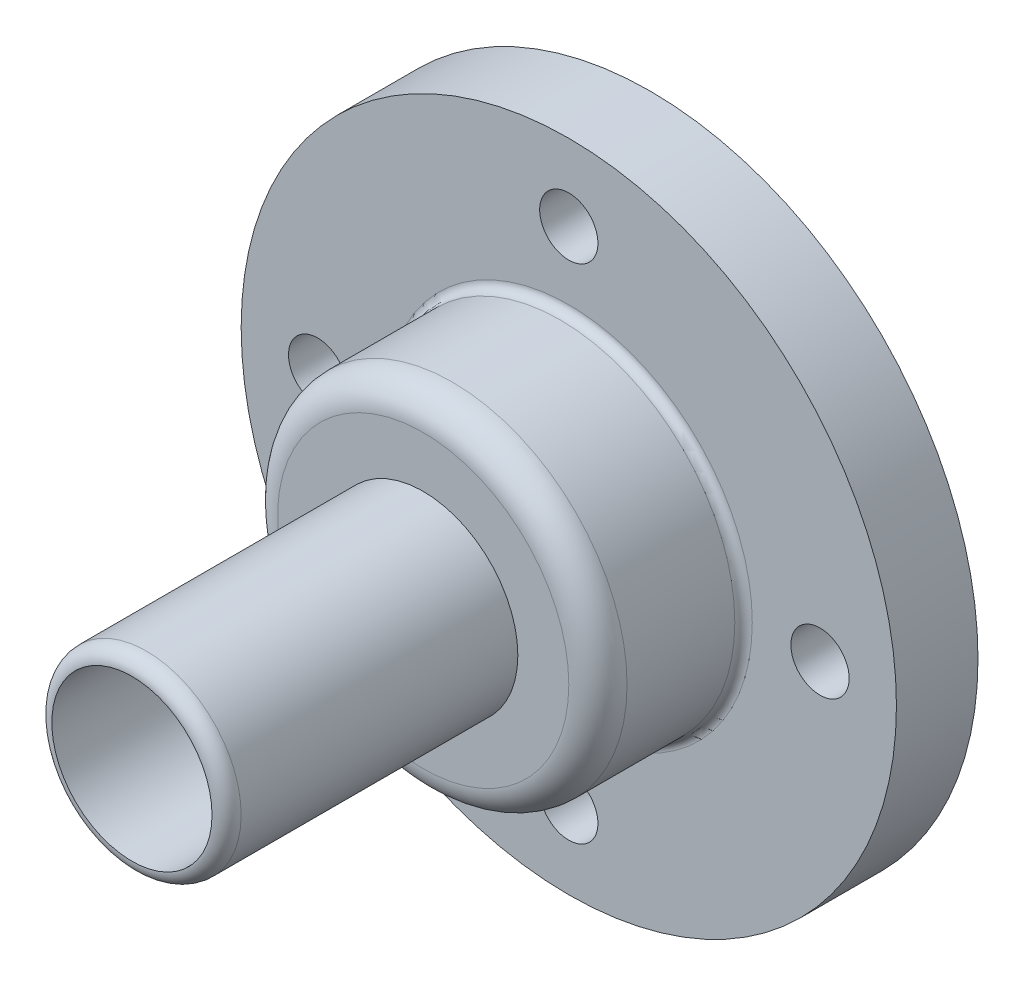
ISO-10303-21;
HEADER;
FILE_DESCRIPTION(('STEP AP214'),'2;1');
FILE_NAME('part.step','',(''),(''),'','','');
FILE_SCHEMA(('AUTOMOTIVE_DESIGN { 1 0 10303 214 1 1 1 1 }'));
ENDSEC;
DATA;
#1=APPLICATION_CONTEXT('core data for automotive mechanical design processes');
#2=APPLICATION_PROTOCOL_DEFINITION('international standard','automotive_design',2000,#1);
#3=PRODUCT_CONTEXT('',#1,'mechanical');
#4=PRODUCT('Part','Part','',(#3));
#5=PRODUCT_RELATED_PRODUCT_CATEGORY('part','',(#4));
#6=PRODUCT_DEFINITION_FORMATION('','',#4);
#7=PRODUCT_DEFINITION_CONTEXT('part definition',#1,'design');
#8=PRODUCT_DEFINITION('design','',#6,#7);
#9=PRODUCT_DEFINITION_SHAPE('','',#8);
#10=(LENGTH_UNIT() NAMED_UNIT(*) SI_UNIT(.MILLI.,.METRE.));
#11=(NAMED_UNIT(*) PLANE_ANGLE_UNIT() SI_UNIT($,.RADIAN.));
#12=(NAMED_UNIT(*) SI_UNIT($,.STERADIAN.) SOLID_ANGLE_UNIT());
#13=UNCERTAINTY_MEASURE_WITH_UNIT(LENGTH_MEASURE(1.E-05),#10,'distance_accuracy_value','');
#14=(GEOMETRIC_REPRESENTATION_CONTEXT(3) GLOBAL_UNCERTAINTY_ASSIGNED_CONTEXT((#13)) GLOBAL_UNIT_ASSIGNED_CONTEXT((#10,
#11,#12)) REPRESENTATION_CONTEXT('',''));
#15=CARTESIAN_POINT('',(0.,0.,0.));
#16=DIRECTION('',(0.,0.,1.));
#17=DIRECTION('',(1.,0.,0.));
#18=AXIS2_PLACEMENT_3D('',#15,#16,#17);
#19=CARTESIAN_POINT('',(0.,0.,28.));
#20=DIRECTION('',(0.,0.,-1.));
#21=DIRECTION('',(-1.,0.,0.));
#22=AXIS2_PLACEMENT_3D('',#19,#20,#21);
#23=CYLINDRICAL_SURFACE('',#22,112.5);
#24=CARTESIAN_POINT('',(0.,0.,28.));
#25=DIRECTION('',(0.,0.,1.));
#26=DIRECTION('',(1.,0.,0.));
#27=AXIS2_PLACEMENT_3D('',#24,#25,#26);
#28=CIRCLE('',#27,112.5);
#29=CARTESIAN_POINT('',(112.5,0.,28.));
#30=VERTEX_POINT('',#29);
#31=EDGE_CURVE('E57',#30,#30,#28,.T.);
#32=ORIENTED_EDGE('',*,*,#31,.F.);
#33=EDGE_LOOP('',(#32));
#34=FACE_BOUND('',#33,.T.);
#35=CARTESIAN_POINT('',(0.,0.,0.));
#36=DIRECTION('',(0.,0.,1.));
#37=DIRECTION('',(1.,0.,0.));
#38=AXIS2_PLACEMENT_3D('',#35,#36,#37);
#39=CIRCLE('',#38,112.5);
#40=CARTESIAN_POINT('',(112.5,0.,0.));
#41=VERTEX_POINT('',#40);
#42=EDGE_CURVE('E58',#41,#41,#39,.T.);
#43=ORIENTED_EDGE('',*,*,#42,.T.);
#44=EDGE_LOOP('',(#43));
#45=FACE_BOUND('',#44,.T.);
#46=ADVANCED_FACE('F34',(#34,#45),#23,.T.);
#47=CARTESIAN_POINT('',(0.,0.,28.));
#48=DIRECTION('',(0.,0.,1.));
#49=DIRECTION('',(1.,0.,0.));
#50=AXIS2_PLACEMENT_3D('',#47,#48,#49);
#51=PLANE('',#50);
#52=CARTESIAN_POINT('',(0.,86.25,28.));
#53=DIRECTION('',(0.,0.,1.));
#54=DIRECTION('',(1.,0.,0.));
#55=AXIS2_PLACEMENT_3D('',#52,#53,#54);
#56=CIRCLE('',#55,10.);
#57=CARTESIAN_POINT('',(10.,86.25,28.));
#58=VERTEX_POINT('',#57);
#59=EDGE_CURVE('E91',#58,#58,#56,.T.);
#60=ORIENTED_EDGE('',*,*,#59,.F.);
#61=EDGE_LOOP('',(#60));
#62=FACE_BOUND('',#61,.T.);
#63=CARTESIAN_POINT('',(86.2500000000024,2.43552857040838E-12,28.));
#64=DIRECTION('',(0.,0.,1.));
#65=DIRECTION('',(1.,0.,0.));
#66=AXIS2_PLACEMENT_3D('',#63,#64,#65);
#67=CIRCLE('',#66,10.0000000000019);
#68=CARTESIAN_POINT('',(96.2500000000043,2.43552857040838E-12,28.));
#69=VERTEX_POINT('',#68);
#70=EDGE_CURVE('E85',#69,#69,#67,.T.);
#71=ORIENTED_EDGE('',*,*,#70,.F.);
#72=EDGE_LOOP('',(#71));
#73=FACE_BOUND('',#72,.T.);
#74=CARTESIAN_POINT('',(4.87105714081675E-12,-86.25,28.));
#75=DIRECTION('',(0.,0.,1.));
#76=DIRECTION('',(1.,0.,0.));
#77=AXIS2_PLACEMENT_3D('',#74,#75,#76);
#78=CIRCLE('',#77,10.0000000000052);
#79=CARTESIAN_POINT('',(10.0000000000101,-86.25,28.));
#80=VERTEX_POINT('',#79);
#81=EDGE_CURVE('E79',#80,#80,#78,.T.);
#82=ORIENTED_EDGE('',*,*,#81,.F.);
#83=EDGE_LOOP('',(#82));
#84=FACE_BOUND('',#83,.T.);
#85=CARTESIAN_POINT('',(-86.2499999999976,-2.44609114905102E-12,28.));
#86=DIRECTION('',(0.,0.,1.));
#87=DIRECTION('',(1.,0.,0.));
#88=AXIS2_PLACEMENT_3D('',#85,#86,#87);
#89=CIRCLE('',#88,10.0000000000039);
#90=CARTESIAN_POINT('',(-76.2499999999937,-2.44609114905102E-12,28.));
#91=VERTEX_POINT('',#90);
#92=EDGE_CURVE('E73',#91,#91,#89,.T.);
#93=ORIENTED_EDGE('',*,*,#92,.F.);
#94=EDGE_LOOP('',(#93));
#95=FACE_BOUND('',#94,.T.);
#96=CARTESIAN_POINT('',(0.,0.,28.));
#97=DIRECTION('',(0.,0.,1.));
#98=DIRECTION('',(1.,0.,0.));
#99=AXIS2_PLACEMENT_3D('',#96,#97,#98);
#100=CIRCLE('',#99,63.);
#101=CARTESIAN_POINT('',(63.,0.,28.));
#102=VERTEX_POINT('',#101);
#103=EDGE_CURVE('E49',#102,#102,#100,.F.);
#104=ORIENTED_EDGE('',*,*,#103,.T.);
#105=EDGE_LOOP('',(#104));
#106=FACE_BOUND('',#105,.T.);
#107=ORIENTED_EDGE('',*,*,#31,.T.);
#108=EDGE_LOOP('',(#107));
#109=FACE_BOUND('',#108,.T.);
#110=ADVANCED_FACE('F107',(#62,#73,#84,#95,#106,#109),#51,.T.);
#111=CARTESIAN_POINT('',(0.,0.,0.));
#112=DIRECTION('',(0.,0.,1.));
#113=DIRECTION('',(1.,0.,0.));
#114=AXIS2_PLACEMENT_3D('',#111,#112,#113);
#115=PLANE('',#114);
#116=CARTESIAN_POINT('',(0.,86.25,0.));
#117=DIRECTION('',(0.,0.,1.));
#118=DIRECTION('',(1.,0.,0.));
#119=AXIS2_PLACEMENT_3D('',#116,#117,#118);
#120=CIRCLE('',#119,10.);
#121=CARTESIAN_POINT('',(10.,86.25,0.));
#122=VERTEX_POINT('',#121);
#123=EDGE_CURVE('E70',#122,#122,#120,.T.);
#124=ORIENTED_EDGE('',*,*,#123,.T.);
#125=EDGE_LOOP('',(#124));
#126=FACE_BOUND('',#125,.T.);
#127=CARTESIAN_POINT('',(86.2500000000024,2.43552857040838E-12,0.));
#128=DIRECTION('',(0.,0.,1.));
#129=DIRECTION('',(1.,0.,0.));
#130=AXIS2_PLACEMENT_3D('',#127,#128,#129);
#131=CIRCLE('',#130,10.0000000000019);
#132=CARTESIAN_POINT('',(96.2500000000043,2.43552857040838E-12,0.));
#133=VERTEX_POINT('',#132);
#134=EDGE_CURVE('E88',#133,#133,#131,.T.);
#135=ORIENTED_EDGE('',*,*,#134,.T.);
#136=EDGE_LOOP('',(#135));
#137=FACE_BOUND('',#136,.T.);
#138=CARTESIAN_POINT('',(4.87105714081675E-12,-86.25,0.));
#139=DIRECTION('',(0.,0.,1.));
#140=DIRECTION('',(1.,0.,0.));
#141=AXIS2_PLACEMENT_3D('',#138,#139,#140);
#142=CIRCLE('',#141,10.0000000000052);
#143=CARTESIAN_POINT('',(10.0000000000101,-86.25,0.));
#144=VERTEX_POINT('',#143);
#145=EDGE_CURVE('E82',#144,#144,#142,.T.);
#146=ORIENTED_EDGE('',*,*,#145,.T.);
#147=EDGE_LOOP('',(#146));
#148=FACE_BOUND('',#147,.T.);
#149=CARTESIAN_POINT('',(-86.2499999999976,-2.44609114905102E-12,0.));
#150=DIRECTION('',(0.,0.,1.));
#151=DIRECTION('',(1.,0.,0.));
#152=AXIS2_PLACEMENT_3D('',#149,#150,#151);
#153=CIRCLE('',#152,10.0000000000039);
#154=CARTESIAN_POINT('',(-76.2499999999937,-2.44609114905102E-12,0.));
#155=VERTEX_POINT('',#154);
#156=EDGE_CURVE('E76',#155,#155,#153,.T.);
#157=ORIENTED_EDGE('',*,*,#156,.T.);
#158=EDGE_LOOP('',(#157));
#159=FACE_BOUND('',#158,.T.);
#160=CARTESIAN_POINT('',(0.,0.,0.));
#161=DIRECTION('',(0.,0.,1.));
#162=DIRECTION('',(1.,0.,0.));
#163=AXIS2_PLACEMENT_3D('',#160,#161,#162);
#164=CIRCLE('',#163,27.5);
#165=CARTESIAN_POINT('',(27.5,0.,0.));
#166=VERTEX_POINT('',#165);
#167=EDGE_CURVE('E66',#166,#166,#164,.T.);
#168=ORIENTED_EDGE('',*,*,#167,.T.);
#169=EDGE_LOOP('',(#168));
#170=FACE_BOUND('',#169,.T.);
#171=ORIENTED_EDGE('',*,*,#42,.F.);
#172=EDGE_LOOP('',(#171));
#173=FACE_BOUND('',#172,.T.);
#174=ADVANCED_FACE('F97',(#126,#137,#148,#159,#170,#173),#115,.F.);
#175=CARTESIAN_POINT('',(0.,0.,78.));
#176=DIRECTION('',(0.,0.,-1.));
#177=DIRECTION('',(-1.,0.,0.));
#178=AXIS2_PLACEMENT_3D('',#175,#176,#177);
#179=CYLINDRICAL_SURFACE('',#178,60.);
#180=CARTESIAN_POINT('',(0.,0.,68.));
#181=DIRECTION('',(0.,0.,1.));
#182=DIRECTION('',(1.,0.,0.));
#183=AXIS2_PLACEMENT_3D('',#180,#181,#182);
#184=CIRCLE('',#183,60.);
#185=CARTESIAN_POINT('',(60.,0.,68.));
#186=VERTEX_POINT('',#185);
#187=EDGE_CURVE('E41',#186,#186,#184,.F.);
#188=ORIENTED_EDGE('',*,*,#187,.T.);
#189=EDGE_LOOP('',(#188));
#190=FACE_BOUND('',#189,.T.);
#191=CARTESIAN_POINT('',(0.,0.,31.));
#192=DIRECTION('',(0.,0.,1.));
#193=DIRECTION('',(1.,0.,0.));
#194=AXIS2_PLACEMENT_3D('',#191,#192,#193);
#195=CIRCLE('',#194,60.);
#196=CARTESIAN_POINT('',(60.,0.,31.));
#197=VERTEX_POINT('',#196);
#198=EDGE_CURVE('E54',#197,#197,#195,.T.);
#199=ORIENTED_EDGE('',*,*,#198,.T.);
#200=EDGE_LOOP('',(#199));
#201=FACE_BOUND('',#200,.T.);
#202=ADVANCED_FACE('F127',(#190,#201),#179,.T.);
#203=CARTESIAN_POINT('',(0.,0.,78.));
#204=DIRECTION('',(0.,0.,1.));
#205=DIRECTION('',(1.,0.,0.));
#206=AXIS2_PLACEMENT_3D('',#203,#204,#205);
#207=PLANE('',#206);
#208=CARTESIAN_POINT('',(0.,0.,78.));
#209=DIRECTION('',(0.,0.,1.));
#210=DIRECTION('',(1.,0.,0.));
#211=AXIS2_PLACEMENT_3D('',#208,#209,#210);
#212=CIRCLE('',#211,32.5);
#213=CARTESIAN_POINT('',(32.5,0.,78.));
#214=VERTEX_POINT('',#213);
#215=EDGE_CURVE('E61',#214,#214,#212,.T.);
#216=ORIENTED_EDGE('',*,*,#215,.F.);
#217=EDGE_LOOP('',(#216));
#218=FACE_BOUND('',#217,.T.);
#219=CARTESIAN_POINT('',(0.,0.,78.));
#220=DIRECTION('',(0.,0.,1.));
#221=DIRECTION('',(1.,0.,0.));
#222=AXIS2_PLACEMENT_3D('',#219,#220,#221);
#223=CIRCLE('',#222,50.);
#224=CARTESIAN_POINT('',(50.,0.,78.));
#225=VERTEX_POINT('',#224);
#226=EDGE_CURVE('E45',#225,#225,#223,.T.);
#227=ORIENTED_EDGE('',*,*,#226,.T.);
#228=EDGE_LOOP('',(#227));
#229=FACE_BOUND('',#228,.T.);
#230=ADVANCED_FACE('F132',(#218,#229),#207,.T.);
#231=CARTESIAN_POINT('',(0.,0.,31.));
#232=DIRECTION('',(0.,0.,1.));
#233=DIRECTION('',(1.,0.,0.));
#234=AXIS2_PLACEMENT_3D('',#231,#232,#233);
#235=TOROIDAL_SURFACE('',#234,63.,3.);
#236=ORIENTED_EDGE('',*,*,#103,.F.);
#237=EDGE_LOOP('',(#236));
#238=FACE_BOUND('',#237,.T.);
#239=ORIENTED_EDGE('',*,*,#198,.F.);
#240=EDGE_LOOP('',(#239));
#241=FACE_BOUND('',#240,.T.);
#242=ADVANCED_FACE('F135',(#238,#241),#235,.F.);
#243=CARTESIAN_POINT('',(0.,0.,68.));
#244=DIRECTION('',(0.,0.,1.));
#245=DIRECTION('',(1.,0.,0.));
#246=AXIS2_PLACEMENT_3D('',#243,#244,#245);
#247=TOROIDAL_SURFACE('',#246,50.,10.);
#248=ORIENTED_EDGE('',*,*,#187,.F.);
#249=EDGE_LOOP('',(#248));
#250=FACE_BOUND('',#249,.T.);
#251=ORIENTED_EDGE('',*,*,#226,.F.);
#252=EDGE_LOOP('',(#251));
#253=FACE_BOUND('',#252,.T.);
#254=ADVANCED_FACE('F137',(#250,#253),#247,.T.);
#255=CARTESIAN_POINT('',(0.,0.,178.));
#256=DIRECTION('',(0.,0.,-1.));
#257=DIRECTION('',(-1.,0.,0.));
#258=AXIS2_PLACEMENT_3D('',#255,#256,#257);
#259=CYLINDRICAL_SURFACE('',#258,32.5);
#260=CARTESIAN_POINT('',(0.,0.,173.));
#261=DIRECTION('',(0.,0.,1.));
#262=DIRECTION('',(1.,0.,0.));
#263=AXIS2_PLACEMENT_3D('',#260,#261,#262);
#264=CIRCLE('',#263,32.5);
#265=CARTESIAN_POINT('',(32.5,0.,173.));
#266=VERTEX_POINT('',#265);
#267=EDGE_CURVE('E10',#266,#266,#264,.F.);
#268=ORIENTED_EDGE('',*,*,#267,.T.);
#269=EDGE_LOOP('',(#268));
#270=FACE_BOUND('',#269,.T.);
#271=ORIENTED_EDGE('',*,*,#215,.T.);
#272=EDGE_LOOP('',(#271));
#273=FACE_BOUND('',#272,.T.);
#274=ADVANCED_FACE('F140',(#270,#273),#259,.T.);
#275=CARTESIAN_POINT('',(0.,0.,0.));
#276=DIRECTION('',(0.,0.,1.));
#277=DIRECTION('',(1.,0.,0.));
#278=AXIS2_PLACEMENT_3D('',#275,#276,#277);
#279=CYLINDRICAL_SURFACE('',#278,27.5);
#280=ORIENTED_EDGE('',*,*,#167,.F.);
#281=EDGE_LOOP('',(#280));
#282=FACE_BOUND('',#281,.T.);
#283=CARTESIAN_POINT('',(0.,0.,178.));
#284=DIRECTION('',(0.,0.,1.));
#285=DIRECTION('',(1.,0.,0.));
#286=AXIS2_PLACEMENT_3D('',#283,#284,#285);
#287=CIRCLE('',#286,27.5);
#288=CARTESIAN_POINT('',(27.5,0.,178.));
#289=VERTEX_POINT('',#288);
#290=EDGE_CURVE('E67',#289,#289,#287,.T.);
#291=ORIENTED_EDGE('',*,*,#290,.T.);
#292=EDGE_LOOP('',(#291));
#293=FACE_BOUND('',#292,.T.);
#294=ADVANCED_FACE('F145',(#282,#293),#279,.F.);
#295=CARTESIAN_POINT('',(-86.2499999999976,-2.44609114905102E-12,0.));
#296=DIRECTION('',(0.,0.,1.));
#297=DIRECTION('',(1.,0.,0.));
#298=AXIS2_PLACEMENT_3D('',#295,#296,#297);
#299=CYLINDRICAL_SURFACE('',#298,10.0000000000039);
#300=ORIENTED_EDGE('',*,*,#156,.F.);
#301=EDGE_LOOP('',(#300));
#302=FACE_BOUND('',#301,.T.);
#303=ORIENTED_EDGE('',*,*,#92,.T.);
#304=EDGE_LOOP('',(#303));
#305=FACE_BOUND('',#304,.T.);
#306=ADVANCED_FACE('F159',(#302,#305),#299,.F.);
#307=CARTESIAN_POINT('',(4.87105714081675E-12,-86.25,0.));
#308=DIRECTION('',(0.,0.,1.));
#309=DIRECTION('',(1.,0.,0.));
#310=AXIS2_PLACEMENT_3D('',#307,#308,#309);
#311=CYLINDRICAL_SURFACE('',#310,10.0000000000052);
#312=ORIENTED_EDGE('',*,*,#145,.F.);
#313=EDGE_LOOP('',(#312));
#314=FACE_BOUND('',#313,.T.);
#315=ORIENTED_EDGE('',*,*,#81,.T.);
#316=EDGE_LOOP('',(#315));
#317=FACE_BOUND('',#316,.T.);
#318=ADVANCED_FACE('F163',(#314,#317),#311,.F.);
#319=CARTESIAN_POINT('',(86.2500000000024,2.43552857040838E-12,0.));
#320=DIRECTION('',(0.,0.,1.));
#321=DIRECTION('',(1.,0.,0.));
#322=AXIS2_PLACEMENT_3D('',#319,#320,#321);
#323=CYLINDRICAL_SURFACE('',#322,10.0000000000019);
#324=ORIENTED_EDGE('',*,*,#134,.F.);
#325=EDGE_LOOP('',(#324));
#326=FACE_BOUND('',#325,.T.);
#327=ORIENTED_EDGE('',*,*,#70,.T.);
#328=EDGE_LOOP('',(#327));
#329=FACE_BOUND('',#328,.T.);
#330=ADVANCED_FACE('F103',(#326,#329),#323,.F.);
#331=CARTESIAN_POINT('',(0.,86.25,0.));
#332=DIRECTION('',(0.,0.,1.));
#333=DIRECTION('',(1.,0.,0.));
#334=AXIS2_PLACEMENT_3D('',#331,#332,#333);
#335=CYLINDRICAL_SURFACE('',#334,10.);
#336=ORIENTED_EDGE('',*,*,#123,.F.);
#337=EDGE_LOOP('',(#336));
#338=FACE_BOUND('',#337,.T.);
#339=ORIENTED_EDGE('',*,*,#59,.T.);
#340=EDGE_LOOP('',(#339));
#341=FACE_BOUND('',#340,.T.);
#342=ADVANCED_FACE('F100',(#338,#341),#335,.F.);
#343=CARTESIAN_POINT('',(0.,0.,173.));
#344=DIRECTION('',(0.,0.,1.));
#345=DIRECTION('',(1.,0.,0.));
#346=AXIS2_PLACEMENT_3D('',#343,#344,#345);
#347=TOROIDAL_SURFACE('',#346,27.5,5.);
#348=ORIENTED_EDGE('',*,*,#267,.F.);
#349=EDGE_LOOP('',(#348));
#350=FACE_BOUND('',#349,.T.);
#351=ORIENTED_EDGE('',*,*,#290,.F.);
#352=EDGE_LOOP('',(#351));
#353=FACE_BOUND('',#352,.T.);
#354=ADVANCED_FACE('F36',(#350,#353),#347,.T.);
#355=CLOSED_SHELL('',(#46,#110,#174,#202,#230,#242,#254,#274,#294,#306,#318,#330,#342,#354));
#356=MANIFOLD_SOLID_BREP('B2',#355);
#357=ADVANCED_BREP_SHAPE_REPRESENTATION('',(#18,#356),#14);
#358=SHAPE_DEFINITION_REPRESENTATION(#9,#357);
ENDSEC;
END-ISO-10303-21;
